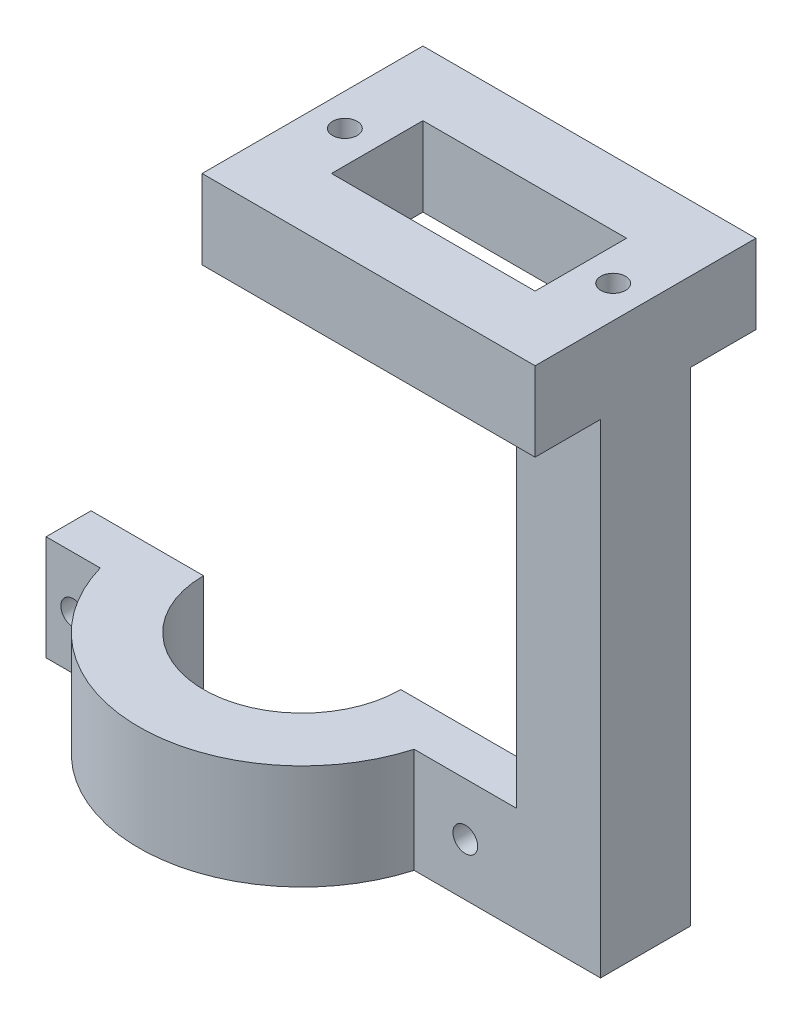
ISO-10303-21;
HEADER;
FILE_DESCRIPTION(('STEP AP214'),'2;1');
FILE_NAME('part.step','',(''),(''),'','','');
FILE_SCHEMA(('AUTOMOTIVE_DESIGN { 1 0 10303 214 1 1 1 1 }'));
ENDSEC;
DATA;
#1=APPLICATION_CONTEXT('core data for automotive mechanical design processes');
#2=APPLICATION_PROTOCOL_DEFINITION('international standard','automotive_design',2000,#1);
#3=PRODUCT_CONTEXT('',#1,'mechanical');
#4=PRODUCT('Part','Part','',(#3));
#5=PRODUCT_RELATED_PRODUCT_CATEGORY('part','',(#4));
#6=PRODUCT_DEFINITION_FORMATION('','',#4);
#7=PRODUCT_DEFINITION_CONTEXT('part definition',#1,'design');
#8=PRODUCT_DEFINITION('design','',#6,#7);
#9=PRODUCT_DEFINITION_SHAPE('','',#8);
#10=(LENGTH_UNIT() NAMED_UNIT(*) SI_UNIT(.MILLI.,.METRE.));
#11=(NAMED_UNIT(*) PLANE_ANGLE_UNIT() SI_UNIT($,.RADIAN.));
#12=(NAMED_UNIT(*) SI_UNIT($,.STERADIAN.) SOLID_ANGLE_UNIT());
#13=UNCERTAINTY_MEASURE_WITH_UNIT(LENGTH_MEASURE(1.E-05),#10,'distance_accuracy_value','');
#14=(GEOMETRIC_REPRESENTATION_CONTEXT(3) GLOBAL_UNCERTAINTY_ASSIGNED_CONTEXT((#13)) GLOBAL_UNIT_ASSIGNED_CONTEXT((#10,
#11,#12)) REPRESENTATION_CONTEXT('',''));
#15=CARTESIAN_POINT('',(0.,0.,0.));
#16=DIRECTION('',(0.,0.,1.));
#17=DIRECTION('',(1.,0.,0.));
#18=AXIS2_PLACEMENT_3D('',#15,#16,#17);
#19=CARTESIAN_POINT('',(-27.351479578733,-58.59,0.));
#20=DIRECTION('',(0.,-1.,0.));
#21=DIRECTION('',(0.,0.,-1.));
#22=AXIS2_PLACEMENT_3D('',#19,#20,#21);
#23=CYLINDRICAL_SURFACE('',#22,25.25);
#24=CARTESIAN_POINT('',(-27.351479578733,-58.59,0.));
#25=DIRECTION('',(0.,-1.,0.));
#26=DIRECTION('',(1.,0.,0.));
#27=AXIS2_PLACEMENT_3D('',#24,#25,#26);
#28=CIRCLE('',#27,25.25);
#29=CARTESIAN_POINT('',(-3.07823350409353,-58.59,6.95499999999999));
#30=VERTEX_POINT('',#29);
#31=CARTESIAN_POINT('',(-51.6247256533725,-58.59,6.955));
#32=VERTEX_POINT('',#31);
#33=EDGE_CURVE('E228',#30,#32,#28,.T.);
#34=ORIENTED_EDGE('',*,*,#33,.T.);
#35=DIRECTION('',(0.,-1.,0.));
#36=VECTOR('',#35,1.);
#37=CARTESIAN_POINT('',(-51.6247256533725,-58.59,6.955));
#38=LINE('',#37,#36);
#39=CARTESIAN_POINT('',(-51.6247256533725,-74.82,6.955));
#40=VERTEX_POINT('',#39);
#41=EDGE_CURVE('E12',#32,#40,#38,.T.);
#42=ORIENTED_EDGE('',*,*,#41,.T.);
#43=CARTESIAN_POINT('',(-27.351479578733,-74.82,0.));
#44=DIRECTION('',(0.,-1.,0.));
#45=DIRECTION('',(1.,0.,0.));
#46=AXIS2_PLACEMENT_3D('',#43,#44,#45);
#47=CIRCLE('',#46,25.25);
#48=CARTESIAN_POINT('',(-3.07823350409353,-74.82,6.955));
#49=VERTEX_POINT('',#48);
#50=EDGE_CURVE('E361',#49,#40,#47,.T.);
#51=ORIENTED_EDGE('',*,*,#50,.F.);
#52=DIRECTION('',(0.,-1.,0.));
#53=VECTOR('',#52,1.);
#54=CARTESIAN_POINT('',(-3.07823350409353,-58.59,6.955));
#55=LINE('',#54,#53);
#56=EDGE_CURVE('E224',#30,#49,#55,.T.);
#57=ORIENTED_EDGE('',*,*,#56,.F.);
#58=EDGE_LOOP('',(#34,#42,#51,#57));
#59=FACE_BOUND('',#58,.T.);
#60=ADVANCED_FACE('F63',(#59),#23,.T.);
#61=CARTESIAN_POINT('',(12.75,-74.82,6.955));
#62=DIRECTION('',(1.,0.,0.));
#63=DIRECTION('',(0.,0.,-1.));
#64=AXIS2_PLACEMENT_3D('',#61,#62,#63);
#65=PLANE('',#64);
#66=DIRECTION('',(0.,0.,-1.));
#67=VECTOR('',#66,1.);
#68=CARTESIAN_POINT('',(12.75,-58.59,-6.955));
#69=LINE('',#68,#67);
#70=CARTESIAN_POINT('',(12.75,-58.59,6.955));
#71=VERTEX_POINT('',#70);
#72=CARTESIAN_POINT('',(12.75,-58.59,0.));
#73=VERTEX_POINT('',#72);
#74=EDGE_CURVE('E206',#71,#73,#69,.T.);
#75=ORIENTED_EDGE('',*,*,#74,.F.);
#76=DIRECTION('',(0.,1.,0.));
#77=VECTOR('',#76,1.);
#78=CARTESIAN_POINT('',(12.75,-74.82,6.955));
#79=LINE('',#78,#77);
#80=CARTESIAN_POINT('',(12.75,0.,6.955));
#81=VERTEX_POINT('',#80);
#82=EDGE_CURVE('E254',#71,#81,#79,.T.);
#83=ORIENTED_EDGE('',*,*,#82,.T.);
#84=DIRECTION('',(0.,0.,-1.));
#85=VECTOR('',#84,1.);
#86=CARTESIAN_POINT('',(12.75,0.,6.955));
#87=LINE('',#86,#85);
#88=CARTESIAN_POINT('',(12.75,0.,-6.955));
#89=VERTEX_POINT('',#88);
#90=EDGE_CURVE('E245',#81,#89,#87,.T.);
#91=ORIENTED_EDGE('',*,*,#90,.T.);
#92=DIRECTION('',(0.,1.,0.));
#93=VECTOR('',#92,1.);
#94=CARTESIAN_POINT('',(12.75,-74.82,-6.955));
#95=LINE('',#94,#93);
#96=CARTESIAN_POINT('',(12.75,-74.82,-6.955));
#97=VERTEX_POINT('',#96);
#98=EDGE_CURVE('E252',#97,#89,#95,.T.);
#99=ORIENTED_EDGE('',*,*,#98,.F.);
#100=DIRECTION('',(0.,0.,1.));
#101=VECTOR('',#100,1.);
#102=CARTESIAN_POINT('',(12.75,-74.82,0.));
#103=LINE('',#102,#101);
#104=CARTESIAN_POINT('',(12.75,-74.82,0.));
#105=VERTEX_POINT('',#104);
#106=EDGE_CURVE('E209',#97,#105,#103,.T.);
#107=ORIENTED_EDGE('',*,*,#106,.T.);
#108=DIRECTION('',(0.,1.,0.));
#109=VECTOR('',#108,1.);
#110=CARTESIAN_POINT('',(12.75,-115.59,0.));
#111=LINE('',#110,#109);
#112=EDGE_CURVE('E202',#105,#73,#111,.T.);
#113=ORIENTED_EDGE('',*,*,#112,.T.);
#114=EDGE_LOOP('',(#75,#83,#91,#99,#107,#113));
#115=FACE_BOUND('',#114,.T.);
#116=ADVANCED_FACE('F204',(#115),#65,.F.);
#117=CARTESIAN_POINT('',(0.,0.,0.));
#118=DIRECTION('',(0.,1.,0.));
#119=DIRECTION('',(0.,0.,1.));
#120=AXIS2_PLACEMENT_3D('',#117,#118,#119);
#121=PLANE('',#120);
#122=CARTESIAN_POINT('',(-20.75,0.,0.));
#123=DIRECTION('',(0.,1.,0.));
#124=DIRECTION('',(0.,0.,1.));
#125=AXIS2_PLACEMENT_3D('',#122,#123,#124);
#126=CIRCLE('',#125,1.91);
#127=CARTESIAN_POINT('',(-20.75,0.,1.91));
#128=VERTEX_POINT('',#127);
#129=EDGE_CURVE('E266',#128,#128,#126,.T.);
#130=ORIENTED_EDGE('',*,*,#129,.T.);
#131=EDGE_LOOP('',(#130));
#132=FACE_BOUND('',#131,.T.);
#133=DIRECTION('',(1.,0.,0.));
#134=VECTOR('',#133,1.);
#135=CARTESIAN_POINT('',(12.75,0.,-6.955));
#136=LINE('',#135,#134);
#137=CARTESIAN_POINT('',(15.75,0.,-6.955));
#138=VERTEX_POINT('',#137);
#139=CARTESIAN_POINT('',(25.75,0.,-6.955));
#140=VERTEX_POINT('',#139);
#141=EDGE_CURVE('E72',#138,#140,#136,.T.);
#142=ORIENTED_EDGE('',*,*,#141,.F.);
#143=DIRECTION('',(0.,0.,-1.));
#144=VECTOR('',#143,1.);
#145=CARTESIAN_POINT('',(15.75,0.,-7.075));
#146=LINE('',#145,#144);
#147=CARTESIAN_POINT('',(15.75,0.,-7.075));
#148=VERTEX_POINT('',#147);
#149=EDGE_CURVE('E269',#138,#148,#146,.T.);
#150=ORIENTED_EDGE('',*,*,#149,.T.);
#151=DIRECTION('',(-1.,0.,0.));
#152=VECTOR('',#151,1.);
#153=CARTESIAN_POINT('',(-15.75,0.,-7.075));
#154=LINE('',#153,#152);
#155=CARTESIAN_POINT('',(-15.75,0.,-7.075));
#156=VERTEX_POINT('',#155);
#157=EDGE_CURVE('E285',#148,#156,#154,.T.);
#158=ORIENTED_EDGE('',*,*,#157,.T.);
#159=DIRECTION('',(0.,0.,1.));
#160=VECTOR('',#159,1.);
#161=CARTESIAN_POINT('',(-15.75,0.,-7.075));
#162=LINE('',#161,#160);
#163=CARTESIAN_POINT('',(-15.75,0.,7.075));
#164=VERTEX_POINT('',#163);
#165=EDGE_CURVE('E289',#156,#164,#162,.T.);
#166=ORIENTED_EDGE('',*,*,#165,.T.);
#167=DIRECTION('',(1.,0.,0.));
#168=VECTOR('',#167,1.);
#169=CARTESIAN_POINT('',(-15.75,0.,7.075));
#170=LINE('',#169,#168);
#171=CARTESIAN_POINT('',(15.75,0.,7.075));
#172=VERTEX_POINT('',#171);
#173=EDGE_CURVE('E275',#164,#172,#170,.T.);
#174=ORIENTED_EDGE('',*,*,#173,.T.);
#175=CARTESIAN_POINT('',(15.75,0.,6.955));
#176=VERTEX_POINT('',#175);
#177=EDGE_CURVE('E283',#172,#176,#146,.T.);
#178=ORIENTED_EDGE('',*,*,#177,.T.);
#179=DIRECTION('',(-1.,0.,0.));
#180=VECTOR('',#179,1.);
#181=CARTESIAN_POINT('',(12.75,0.,6.955));
#182=LINE('',#181,#180);
#183=CARTESIAN_POINT('',(25.75,0.,6.955));
#184=VERTEX_POINT('',#183);
#185=EDGE_CURVE('E242',#184,#176,#182,.T.);
#186=ORIENTED_EDGE('',*,*,#185,.F.);
#187=DIRECTION('',(0.,0.,-1.));
#188=VECTOR('',#187,1.);
#189=CARTESIAN_POINT('',(25.75,0.,-7.075));
#190=LINE('',#189,#188);
#191=CARTESIAN_POINT('',(25.75,0.,17.075));
#192=VERTEX_POINT('',#191);
#193=EDGE_CURVE('E315',#192,#184,#190,.T.);
#194=ORIENTED_EDGE('',*,*,#193,.F.);
#195=DIRECTION('',(1.,0.,0.));
#196=VECTOR('',#195,1.);
#197=CARTESIAN_POINT('',(-15.75,0.,17.075));
#198=LINE('',#197,#196);
#199=CARTESIAN_POINT('',(-25.75,0.,17.075));
#200=VERTEX_POINT('',#199);
#201=EDGE_CURVE('E308',#200,#192,#198,.T.);
#202=ORIENTED_EDGE('',*,*,#201,.F.);
#203=DIRECTION('',(0.,0.,1.));
#204=VECTOR('',#203,1.);
#205=CARTESIAN_POINT('',(-25.75,0.,-7.075));
#206=LINE('',#205,#204);
#207=CARTESIAN_POINT('',(-25.75,0.,-17.075));
#208=VERTEX_POINT('',#207);
#209=EDGE_CURVE('E320',#208,#200,#206,.T.);
#210=ORIENTED_EDGE('',*,*,#209,.F.);
#211=DIRECTION('',(-1.,0.,0.));
#212=VECTOR('',#211,1.);
#213=CARTESIAN_POINT('',(-15.75,0.,-17.075));
#214=LINE('',#213,#212);
#215=CARTESIAN_POINT('',(25.75,0.,-17.075));
#216=VERTEX_POINT('',#215);
#217=EDGE_CURVE('E318',#216,#208,#214,.T.);
#218=ORIENTED_EDGE('',*,*,#217,.F.);
#219=EDGE_CURVE('E303',#140,#216,#190,.T.);
#220=ORIENTED_EDGE('',*,*,#219,.F.);
#221=EDGE_LOOP('',(#142,#150,#158,#166,#174,#178,#186,#194,#202,#210,#218,#220));
#222=FACE_BOUND('',#221,.T.);
#223=ADVANCED_FACE('F411',(#132,#222),#121,.F.);
#224=CARTESIAN_POINT('',(0.,12.25,0.));
#225=DIRECTION('',(0.,1.,0.));
#226=DIRECTION('',(0.,0.,1.));
#227=AXIS2_PLACEMENT_3D('',#224,#225,#226);
#228=PLANE('',#227);
#229=CARTESIAN_POINT('',(20.75,12.25,0.));
#230=DIRECTION('',(0.,1.,0.));
#231=DIRECTION('',(0.,0.,1.));
#232=AXIS2_PLACEMENT_3D('',#229,#230,#231);
#233=CIRCLE('',#232,1.91);
#234=CARTESIAN_POINT('',(20.75,12.25,1.91));
#235=VERTEX_POINT('',#234);
#236=EDGE_CURVE('E259',#235,#235,#233,.T.);
#237=ORIENTED_EDGE('',*,*,#236,.F.);
#238=EDGE_LOOP('',(#237));
#239=FACE_BOUND('',#238,.T.);
#240=CARTESIAN_POINT('',(-20.75,12.25,0.));
#241=DIRECTION('',(0.,1.,0.));
#242=DIRECTION('',(0.,0.,1.));
#243=AXIS2_PLACEMENT_3D('',#240,#241,#242);
#244=CIRCLE('',#243,1.91);
#245=CARTESIAN_POINT('',(-20.75,12.25,1.91));
#246=VERTEX_POINT('',#245);
#247=EDGE_CURVE('E263',#246,#246,#244,.T.);
#248=ORIENTED_EDGE('',*,*,#247,.F.);
#249=EDGE_LOOP('',(#248));
#250=FACE_BOUND('',#249,.T.);
#251=DIRECTION('',(0.,0.,-1.));
#252=VECTOR('',#251,1.);
#253=CARTESIAN_POINT('',(25.75,12.25,-7.075));
#254=LINE('',#253,#252);
#255=CARTESIAN_POINT('',(25.75,12.25,17.075));
#256=VERTEX_POINT('',#255);
#257=CARTESIAN_POINT('',(25.75,12.25,-17.075));
#258=VERTEX_POINT('',#257);
#259=EDGE_CURVE('E304',#256,#258,#254,.T.);
#260=ORIENTED_EDGE('',*,*,#259,.T.);
#261=DIRECTION('',(-1.,0.,0.));
#262=VECTOR('',#261,1.);
#263=CARTESIAN_POINT('',(-15.75,12.25,-17.075));
#264=LINE('',#263,#262);
#265=CARTESIAN_POINT('',(-25.75,12.25,-17.075));
#266=VERTEX_POINT('',#265);
#267=EDGE_CURVE('E307',#258,#266,#264,.T.);
#268=ORIENTED_EDGE('',*,*,#267,.T.);
#269=DIRECTION('',(0.,0.,1.));
#270=VECTOR('',#269,1.);
#271=CARTESIAN_POINT('',(-25.75,12.25,-7.075));
#272=LINE('',#271,#270);
#273=CARTESIAN_POINT('',(-25.75,12.25,17.075));
#274=VERTEX_POINT('',#273);
#275=EDGE_CURVE('E310',#266,#274,#272,.T.);
#276=ORIENTED_EDGE('',*,*,#275,.T.);
#277=DIRECTION('',(1.,0.,0.));
#278=VECTOR('',#277,1.);
#279=CARTESIAN_POINT('',(-15.75,12.25,17.075));
#280=LINE('',#279,#278);
#281=EDGE_CURVE('E312',#274,#256,#280,.T.);
#282=ORIENTED_EDGE('',*,*,#281,.T.);
#283=EDGE_LOOP('',(#260,#268,#276,#282));
#284=FACE_BOUND('',#283,.T.);
#285=DIRECTION('',(-1.,0.,0.));
#286=VECTOR('',#285,1.);
#287=CARTESIAN_POINT('',(-15.75,12.25,-7.075));
#288=LINE('',#287,#286);
#289=CARTESIAN_POINT('',(15.75,12.25,-7.075));
#290=VERTEX_POINT('',#289);
#291=CARTESIAN_POINT('',(-15.75,12.25,-7.075));
#292=VERTEX_POINT('',#291);
#293=EDGE_CURVE('E274',#290,#292,#288,.T.);
#294=ORIENTED_EDGE('',*,*,#293,.F.);
#295=DIRECTION('',(0.,0.,-1.));
#296=VECTOR('',#295,1.);
#297=CARTESIAN_POINT('',(15.75,12.25,-7.075));
#298=LINE('',#297,#296);
#299=CARTESIAN_POINT('',(15.75,12.25,7.075));
#300=VERTEX_POINT('',#299);
#301=EDGE_CURVE('E272',#300,#290,#298,.T.);
#302=ORIENTED_EDGE('',*,*,#301,.F.);
#303=DIRECTION('',(1.,0.,0.));
#304=VECTOR('',#303,1.);
#305=CARTESIAN_POINT('',(-15.75,12.25,7.075));
#306=LINE('',#305,#304);
#307=CARTESIAN_POINT('',(-15.75,12.25,7.075));
#308=VERTEX_POINT('',#307);
#309=EDGE_CURVE('E280',#308,#300,#306,.T.);
#310=ORIENTED_EDGE('',*,*,#309,.F.);
#311=DIRECTION('',(0.,0.,1.));
#312=VECTOR('',#311,1.);
#313=CARTESIAN_POINT('',(-15.75,12.25,-7.075));
#314=LINE('',#313,#312);
#315=EDGE_CURVE('E277',#292,#308,#314,.T.);
#316=ORIENTED_EDGE('',*,*,#315,.F.);
#317=EDGE_LOOP('',(#294,#302,#310,#316));
#318=FACE_BOUND('',#317,.T.);
#319=ADVANCED_FACE('F458',(#239,#250,#284,#318),#228,.T.);
#320=CARTESIAN_POINT('',(25.75,12.25,-7.075));
#321=DIRECTION('',(-1.,0.,0.));
#322=DIRECTION('',(0.,0.,1.));
#323=AXIS2_PLACEMENT_3D('',#320,#321,#322);
#324=PLANE('',#323);
#325=ORIENTED_EDGE('',*,*,#193,.T.);
#326=DIRECTION('',(0.,1.,0.));
#327=VECTOR('',#326,1.);
#328=CARTESIAN_POINT('',(25.75,-74.82,6.955));
#329=LINE('',#328,#327);
#330=CARTESIAN_POINT('',(25.75,-74.82,6.955));
#331=VERTEX_POINT('',#330);
#332=EDGE_CURVE('E256',#331,#184,#329,.T.);
#333=ORIENTED_EDGE('',*,*,#332,.F.);
#334=DIRECTION('',(0.,0.,1.));
#335=VECTOR('',#334,1.);
#336=CARTESIAN_POINT('',(25.75,-74.82,6.955));
#337=LINE('',#336,#335);
#338=CARTESIAN_POINT('',(25.75,-74.82,-6.955));
#339=VERTEX_POINT('',#338);
#340=EDGE_CURVE('E232',#339,#331,#337,.T.);
#341=ORIENTED_EDGE('',*,*,#340,.F.);
#342=DIRECTION('',(0.,1.,0.));
#343=VECTOR('',#342,1.);
#344=CARTESIAN_POINT('',(25.75,-74.82,-6.955));
#345=LINE('',#344,#343);
#346=EDGE_CURVE('E241',#339,#140,#345,.T.);
#347=ORIENTED_EDGE('',*,*,#346,.T.);
#348=ORIENTED_EDGE('',*,*,#219,.T.);
#349=DIRECTION('',(0.,-1.,0.));
#350=VECTOR('',#349,1.);
#351=CARTESIAN_POINT('',(25.75,12.25,-17.075));
#352=LINE('',#351,#350);
#353=EDGE_CURVE('E331',#258,#216,#352,.T.);
#354=ORIENTED_EDGE('',*,*,#353,.F.);
#355=ORIENTED_EDGE('',*,*,#259,.F.);
#356=DIRECTION('',(0.,-1.,0.));
#357=VECTOR('',#356,1.);
#358=CARTESIAN_POINT('',(25.75,12.25,17.075));
#359=LINE('',#358,#357);
#360=EDGE_CURVE('E314',#256,#192,#359,.T.);
#361=ORIENTED_EDGE('',*,*,#360,.T.);
#362=EDGE_LOOP('',(#325,#333,#341,#347,#348,#354,#355,#361));
#363=FACE_BOUND('',#362,.T.);
#364=ADVANCED_FACE('F65',(#363),#324,.F.);
#365=CARTESIAN_POINT('',(-15.75,12.25,-17.075));
#366=DIRECTION('',(0.,0.,1.));
#367=DIRECTION('',(1.,0.,0.));
#368=AXIS2_PLACEMENT_3D('',#365,#366,#367);
#369=PLANE('',#368);
#370=ORIENTED_EDGE('',*,*,#217,.T.);
#371=DIRECTION('',(0.,-1.,0.));
#372=VECTOR('',#371,1.);
#373=CARTESIAN_POINT('',(-25.75,12.25,-17.075));
#374=LINE('',#373,#372);
#375=EDGE_CURVE('E328',#266,#208,#374,.T.);
#376=ORIENTED_EDGE('',*,*,#375,.F.);
#377=ORIENTED_EDGE('',*,*,#267,.F.);
#378=ORIENTED_EDGE('',*,*,#353,.T.);
#379=EDGE_LOOP('',(#370,#376,#377,#378));
#380=FACE_BOUND('',#379,.T.);
#381=ADVANCED_FACE('F470',(#380),#369,.F.);
#382=CARTESIAN_POINT('',(-25.75,12.25,-7.075));
#383=DIRECTION('',(1.,0.,0.));
#384=DIRECTION('',(0.,0.,-1.));
#385=AXIS2_PLACEMENT_3D('',#382,#383,#384);
#386=PLANE('',#385);
#387=ORIENTED_EDGE('',*,*,#209,.T.);
#388=DIRECTION('',(0.,-1.,0.));
#389=VECTOR('',#388,1.);
#390=CARTESIAN_POINT('',(-25.75,12.25,17.075));
#391=LINE('',#390,#389);
#392=EDGE_CURVE('E325',#274,#200,#391,.T.);
#393=ORIENTED_EDGE('',*,*,#392,.F.);
#394=ORIENTED_EDGE('',*,*,#275,.F.);
#395=ORIENTED_EDGE('',*,*,#375,.T.);
#396=EDGE_LOOP('',(#387,#393,#394,#395));
#397=FACE_BOUND('',#396,.T.);
#398=ADVANCED_FACE('F467',(#397),#386,.F.);
#399=CARTESIAN_POINT('',(-15.75,12.25,17.075));
#400=DIRECTION('',(0.,0.,-1.));
#401=DIRECTION('',(-1.,0.,0.));
#402=AXIS2_PLACEMENT_3D('',#399,#400,#401);
#403=PLANE('',#402);
#404=ORIENTED_EDGE('',*,*,#201,.T.);
#405=ORIENTED_EDGE('',*,*,#360,.F.);
#406=ORIENTED_EDGE('',*,*,#281,.F.);
#407=ORIENTED_EDGE('',*,*,#392,.T.);
#408=EDGE_LOOP('',(#404,#405,#406,#407));
#409=FACE_BOUND('',#408,.T.);
#410=ADVANCED_FACE('F456',(#409),#403,.F.);
#411=CARTESIAN_POINT('',(15.75,12.25,-7.075));
#412=DIRECTION('',(-1.,0.,0.));
#413=DIRECTION('',(0.,0.,1.));
#414=AXIS2_PLACEMENT_3D('',#411,#412,#413);
#415=PLANE('',#414);
#416=ORIENTED_EDGE('',*,*,#177,.F.);
#417=DIRECTION('',(0.,-1.,0.));
#418=VECTOR('',#417,1.);
#419=CARTESIAN_POINT('',(15.75,12.25,7.075));
#420=LINE('',#419,#418);
#421=EDGE_CURVE('E282',#300,#172,#420,.T.);
#422=ORIENTED_EDGE('',*,*,#421,.F.);
#423=ORIENTED_EDGE('',*,*,#301,.T.);
#424=DIRECTION('',(0.,-1.,0.));
#425=VECTOR('',#424,1.);
#426=CARTESIAN_POINT('',(15.75,12.25,-7.075));
#427=LINE('',#426,#425);
#428=EDGE_CURVE('E300',#290,#148,#427,.T.);
#429=ORIENTED_EDGE('',*,*,#428,.T.);
#430=ORIENTED_EDGE('',*,*,#149,.F.);
#431=EDGE_CURVE('E286',#176,#138,#146,.T.);
#432=ORIENTED_EDGE('',*,*,#431,.F.);
#433=EDGE_LOOP('',(#416,#422,#423,#429,#430,#432));
#434=FACE_BOUND('',#433,.T.);
#435=ADVANCED_FACE('F452',(#434),#415,.T.);
#436=CARTESIAN_POINT('',(-15.75,12.25,-7.075));
#437=DIRECTION('',(0.,0.,1.));
#438=DIRECTION('',(1.,0.,0.));
#439=AXIS2_PLACEMENT_3D('',#436,#437,#438);
#440=PLANE('',#439);
#441=ORIENTED_EDGE('',*,*,#157,.F.);
#442=ORIENTED_EDGE('',*,*,#428,.F.);
#443=ORIENTED_EDGE('',*,*,#293,.T.);
#444=DIRECTION('',(0.,-1.,0.));
#445=VECTOR('',#444,1.);
#446=CARTESIAN_POINT('',(-15.75,12.25,-7.075));
#447=LINE('',#446,#445);
#448=EDGE_CURVE('E298',#292,#156,#447,.T.);
#449=ORIENTED_EDGE('',*,*,#448,.T.);
#450=EDGE_LOOP('',(#441,#442,#443,#449));
#451=FACE_BOUND('',#450,.T.);
#452=ADVANCED_FACE('F448',(#451),#440,.T.);
#453=CARTESIAN_POINT('',(-15.75,12.25,-7.075));
#454=DIRECTION('',(1.,0.,0.));
#455=DIRECTION('',(0.,0.,-1.));
#456=AXIS2_PLACEMENT_3D('',#453,#454,#455);
#457=PLANE('',#456);
#458=ORIENTED_EDGE('',*,*,#165,.F.);
#459=ORIENTED_EDGE('',*,*,#448,.F.);
#460=ORIENTED_EDGE('',*,*,#315,.T.);
#461=DIRECTION('',(0.,-1.,0.));
#462=VECTOR('',#461,1.);
#463=CARTESIAN_POINT('',(-15.75,12.25,7.075));
#464=LINE('',#463,#462);
#465=EDGE_CURVE('E296',#308,#164,#464,.T.);
#466=ORIENTED_EDGE('',*,*,#465,.T.);
#467=EDGE_LOOP('',(#458,#459,#460,#466));
#468=FACE_BOUND('',#467,.T.);
#469=ADVANCED_FACE('F444',(#468),#457,.T.);
#470=CARTESIAN_POINT('',(-15.75,12.25,7.075));
#471=DIRECTION('',(0.,0.,-1.));
#472=DIRECTION('',(-1.,0.,0.));
#473=AXIS2_PLACEMENT_3D('',#470,#471,#472);
#474=PLANE('',#473);
#475=ORIENTED_EDGE('',*,*,#173,.F.);
#476=ORIENTED_EDGE('',*,*,#465,.F.);
#477=ORIENTED_EDGE('',*,*,#309,.T.);
#478=ORIENTED_EDGE('',*,*,#421,.T.);
#479=EDGE_LOOP('',(#475,#476,#477,#478));
#480=FACE_BOUND('',#479,.T.);
#481=ADVANCED_FACE('F440',(#480),#474,.T.);
#482=CARTESIAN_POINT('',(-20.75,0.,0.));
#483=DIRECTION('',(0.,1.,0.));
#484=DIRECTION('',(0.,0.,1.));
#485=AXIS2_PLACEMENT_3D('',#482,#483,#484);
#486=CYLINDRICAL_SURFACE('',#485,1.91);
#487=ORIENTED_EDGE('',*,*,#129,.F.);
#488=EDGE_LOOP('',(#487));
#489=FACE_BOUND('',#488,.T.);
#490=ORIENTED_EDGE('',*,*,#247,.T.);
#491=EDGE_LOOP('',(#490));
#492=FACE_BOUND('',#491,.T.);
#493=ADVANCED_FACE('F436',(#489,#492),#486,.F.);
#494=CARTESIAN_POINT('',(20.75,0.,0.));
#495=DIRECTION('',(0.,1.,0.));
#496=DIRECTION('',(0.,0.,1.));
#497=AXIS2_PLACEMENT_3D('',#494,#495,#496);
#498=CYLINDRICAL_SURFACE('',#497,1.91);
#499=CARTESIAN_POINT('',(20.75,0.,0.));
#500=DIRECTION('',(0.,1.,0.));
#501=DIRECTION('',(0.,0.,1.));
#502=AXIS2_PLACEMENT_3D('',#499,#500,#501);
#503=CIRCLE('',#502,1.91);
#504=CARTESIAN_POINT('',(20.75,0.,1.91));
#505=VERTEX_POINT('',#504);
#506=EDGE_CURVE('E260',#505,#505,#503,.T.);
#507=ORIENTED_EDGE('',*,*,#506,.F.);
#508=EDGE_LOOP('',(#507));
#509=FACE_BOUND('',#508,.T.);
#510=ORIENTED_EDGE('',*,*,#236,.T.);
#511=EDGE_LOOP('',(#510));
#512=FACE_BOUND('',#511,.T.);
#513=ADVANCED_FACE('F422',(#509,#512),#498,.F.);
#514=CARTESIAN_POINT('',(0.,-74.82,0.));
#515=DIRECTION('',(0.,-1.,0.));
#516=DIRECTION('',(0.,0.,-1.));
#517=AXIS2_PLACEMENT_3D('',#514,#515,#516);
#518=PLANE('',#517);
#519=ORIENTED_EDGE('',*,*,#106,.F.);
#520=DIRECTION('',(1.,0.,0.));
#521=VECTOR('',#520,1.);
#522=CARTESIAN_POINT('',(12.75,-74.82,-6.955));
#523=LINE('',#522,#521);
#524=EDGE_CURVE('E239',#97,#339,#523,.T.);
#525=ORIENTED_EDGE('',*,*,#524,.T.);
#526=ORIENTED_EDGE('',*,*,#340,.T.);
#527=DIRECTION('',(-1.,0.,0.));
#528=VECTOR('',#527,1.);
#529=CARTESIAN_POINT('',(12.75,-74.82,6.955));
#530=LINE('',#529,#528);
#531=EDGE_CURVE('E235',#331,#49,#530,.T.);
#532=ORIENTED_EDGE('',*,*,#531,.T.);
#533=ORIENTED_EDGE('',*,*,#50,.T.);
#534=DIRECTION('',(-1.,0.,0.));
#535=VECTOR('',#534,1.);
#536=CARTESIAN_POINT('',(-50.,-74.82,6.955));
#537=LINE('',#536,#535);
#538=CARTESIAN_POINT('',(-60.,-74.82,6.955));
#539=VERTEX_POINT('',#538);
#540=EDGE_CURVE('E355',#40,#539,#537,.T.);
#541=ORIENTED_EDGE('',*,*,#540,.T.);
#542=DIRECTION('',(0.,0.,-1.));
#543=VECTOR('',#542,1.);
#544=CARTESIAN_POINT('',(-60.,-74.82,-6.955));
#545=LINE('',#544,#543);
#546=CARTESIAN_POINT('',(-60.,-74.82,0.));
#547=VERTEX_POINT('',#546);
#548=EDGE_CURVE('E352',#539,#547,#545,.T.);
#549=ORIENTED_EDGE('',*,*,#548,.T.);
#550=DIRECTION('',(-1.,0.,0.));
#551=VECTOR('',#550,1.);
#552=CARTESIAN_POINT('',(0.,-74.82,0.));
#553=LINE('',#552,#551);
#554=CARTESIAN_POINT('',(-42.601479578733,-74.82,0.));
#555=VERTEX_POINT('',#554);
#556=EDGE_CURVE('E88',#555,#547,#553,.T.);
#557=ORIENTED_EDGE('',*,*,#556,.F.);
#558=CARTESIAN_POINT('',(-27.351479578733,-74.82,0.));
#559=DIRECTION('',(0.,-1.,0.));
#560=DIRECTION('',(0.,0.,-1.));
#561=AXIS2_PLACEMENT_3D('',#558,#559,#560);
#562=CIRCLE('',#561,15.25);
#563=CARTESIAN_POINT('',(-12.101479578733,-74.82,0.));
#564=VERTEX_POINT('',#563);
#565=EDGE_CURVE('E336',#564,#555,#562,.T.);
#566=ORIENTED_EDGE('',*,*,#565,.F.);
#567=EDGE_CURVE('E80',#105,#564,#553,.T.);
#568=ORIENTED_EDGE('',*,*,#567,.F.);
#569=EDGE_LOOP('',(#519,#525,#526,#532,#533,#541,#549,#557,#566,#568));
#570=FACE_BOUND('',#569,.T.);
#571=ADVANCED_FACE('F368',(#570),#518,.T.);
#572=CARTESIAN_POINT('',(12.75,-74.82,-6.955));
#573=DIRECTION('',(0.,0.,1.));
#574=DIRECTION('',(1.,0.,0.));
#575=AXIS2_PLACEMENT_3D('',#572,#573,#574);
#576=PLANE('',#575);
#577=ORIENTED_EDGE('',*,*,#524,.F.);
#578=ORIENTED_EDGE('',*,*,#98,.T.);
#579=EDGE_CURVE('E236',#89,#138,#136,.T.);
#580=ORIENTED_EDGE('',*,*,#579,.T.);
#581=ORIENTED_EDGE('',*,*,#141,.T.);
#582=ORIENTED_EDGE('',*,*,#346,.F.);
#583=EDGE_LOOP('',(#577,#578,#580,#581,#582));
#584=FACE_BOUND('',#583,.T.);
#585=ADVANCED_FACE('F421',(#584),#576,.F.);
#586=CARTESIAN_POINT('',(12.75,-74.82,6.955));
#587=DIRECTION('',(0.,0.,-1.));
#588=DIRECTION('',(-1.,0.,0.));
#589=AXIS2_PLACEMENT_3D('',#586,#587,#588);
#590=PLANE('',#589);
#591=CARTESIAN_POINT('',(4.83588324795129,-66.7050000000066,6.955));
#592=DIRECTION('',(0.,0.,-1.));
#593=DIRECTION('',(-1.,0.,0.));
#594=AXIS2_PLACEMENT_3D('',#591,#592,#593);
#595=CIRCLE('',#594,1.91);
#596=CARTESIAN_POINT('',(2.92588324795129,-66.7050000000066,6.955));
#597=VERTEX_POINT('',#596);
#598=EDGE_CURVE('E334',#597,#597,#595,.T.);
#599=ORIENTED_EDGE('',*,*,#598,.T.);
#600=EDGE_LOOP('',(#599));
#601=FACE_BOUND('',#600,.T.);
#602=DIRECTION('',(1.,0.,0.));
#603=VECTOR('',#602,1.);
#604=CARTESIAN_POINT('',(-3.25,-58.59,6.95499999999999));
#605=LINE('',#604,#603);
#606=EDGE_CURVE('E223',#30,#71,#605,.T.);
#607=ORIENTED_EDGE('',*,*,#606,.F.);
#608=ORIENTED_EDGE('',*,*,#56,.T.);
#609=ORIENTED_EDGE('',*,*,#531,.F.);
#610=ORIENTED_EDGE('',*,*,#332,.T.);
#611=ORIENTED_EDGE('',*,*,#185,.T.);
#612=EDGE_CURVE('E226',#176,#81,#182,.T.);
#613=ORIENTED_EDGE('',*,*,#612,.T.);
#614=ORIENTED_EDGE('',*,*,#82,.F.);
#615=EDGE_LOOP('',(#607,#608,#609,#610,#611,#613,#614));
#616=FACE_BOUND('',#615,.T.);
#617=ADVANCED_FACE('F428',(#601,#616),#590,.F.);
#618=CARTESIAN_POINT('',(0.,0.,0.));
#619=DIRECTION('',(0.,-1.,0.));
#620=DIRECTION('',(0.,0.,-1.));
#621=AXIS2_PLACEMENT_3D('',#618,#619,#620);
#622=PLANE('',#621);
#623=ORIENTED_EDGE('',*,*,#612,.F.);
#624=ORIENTED_EDGE('',*,*,#431,.T.);
#625=ORIENTED_EDGE('',*,*,#579,.F.);
#626=ORIENTED_EDGE('',*,*,#90,.F.);
#627=EDGE_LOOP('',(#623,#624,#625,#626));
#628=FACE_BOUND('',#627,.T.);
#629=ADVANCED_FACE('F425',(#628),#622,.F.);
#630=ORIENTED_EDGE('',*,*,#506,.T.);
#631=EDGE_LOOP('',(#630));
#632=FACE_BOUND('',#631,.T.);
#633=ADVANCED_FACE('F418',(#632),#622,.F.);
#634=CARTESIAN_POINT('',(-3.25,-58.59,-6.95500000000001));
#635=DIRECTION('',(0.,-1.,0.));
#636=DIRECTION('',(0.,0.,-1.));
#637=AXIS2_PLACEMENT_3D('',#634,#635,#636);
#638=PLANE('',#637);
#639=ORIENTED_EDGE('',*,*,#74,.T.);
#640=DIRECTION('',(1.,0.,0.));
#641=VECTOR('',#640,1.);
#642=CARTESIAN_POINT('',(12.75,-58.59,0.));
#643=LINE('',#642,#641);
#644=CARTESIAN_POINT('',(-12.101479578733,-58.59,0.));
#645=VERTEX_POINT('',#644);
#646=EDGE_CURVE('E213',#645,#73,#643,.T.);
#647=ORIENTED_EDGE('',*,*,#646,.F.);
#648=CARTESIAN_POINT('',(-27.351479578733,-58.59,0.));
#649=DIRECTION('',(0.,-1.,0.));
#650=DIRECTION('',(0.,0.,-1.));
#651=AXIS2_PLACEMENT_3D('',#648,#649,#650);
#652=CIRCLE('',#651,15.25);
#653=CARTESIAN_POINT('',(-42.601479578733,-58.59,0.));
#654=VERTEX_POINT('',#653);
#655=EDGE_CURVE('E359',#645,#654,#652,.T.);
#656=ORIENTED_EDGE('',*,*,#655,.T.);
#657=CARTESIAN_POINT('',(-60.,-58.59,0.));
#658=VERTEX_POINT('',#657);
#659=EDGE_CURVE('E210',#658,#654,#643,.T.);
#660=ORIENTED_EDGE('',*,*,#659,.F.);
#661=DIRECTION('',(0.,0.,1.));
#662=VECTOR('',#661,1.);
#663=CARTESIAN_POINT('',(-60.,-58.59,-6.955));
#664=LINE('',#663,#662);
#665=CARTESIAN_POINT('',(-60.,-58.59,6.955));
#666=VERTEX_POINT('',#665);
#667=EDGE_CURVE('E340',#658,#666,#664,.T.);
#668=ORIENTED_EDGE('',*,*,#667,.T.);
#669=DIRECTION('',(-1.,0.,0.));
#670=VECTOR('',#669,1.);
#671=CARTESIAN_POINT('',(-50.,-58.59,6.955));
#672=LINE('',#671,#670);
#673=EDGE_CURVE('E337',#32,#666,#672,.T.);
#674=ORIENTED_EDGE('',*,*,#673,.F.);
#675=ORIENTED_EDGE('',*,*,#33,.F.);
#676=ORIENTED_EDGE('',*,*,#606,.T.);
#677=EDGE_LOOP('',(#639,#647,#656,#660,#668,#674,#675,#676));
#678=FACE_BOUND('',#677,.T.);
#679=ADVANCED_FACE('F221',(#678),#638,.F.);
#680=CARTESIAN_POINT('',(-27.351479578733,-58.59,0.));
#681=DIRECTION('',(0.,-1.,0.));
#682=DIRECTION('',(0.,0.,-1.));
#683=AXIS2_PLACEMENT_3D('',#680,#681,#682);
#684=CYLINDRICAL_SURFACE('',#683,15.25);
#685=ORIENTED_EDGE('',*,*,#565,.T.);
#686=DIRECTION('',(0.,-1.,0.));
#687=VECTOR('',#686,1.);
#688=CARTESIAN_POINT('',(-42.601479578733,-58.59,0.));
#689=LINE('',#688,#687);
#690=EDGE_CURVE('E382',#555,#654,#689,.F.);
#691=ORIENTED_EDGE('',*,*,#690,.T.);
#692=ORIENTED_EDGE('',*,*,#655,.F.);
#693=DIRECTION('',(0.,-1.,0.));
#694=VECTOR('',#693,1.);
#695=CARTESIAN_POINT('',(-12.101479578733,-58.59,0.));
#696=LINE('',#695,#694);
#697=EDGE_CURVE('E216',#645,#564,#696,.T.);
#698=ORIENTED_EDGE('',*,*,#697,.T.);
#699=EDGE_LOOP('',(#685,#691,#692,#698));
#700=FACE_BOUND('',#699,.T.);
#701=ADVANCED_FACE('F385',(#700),#684,.F.);
#702=CARTESIAN_POINT('',(4.83588324795129,-66.7050000000066,25.25));
#703=DIRECTION('',(0.,0.,-1.));
#704=DIRECTION('',(-1.,0.,0.));
#705=AXIS2_PLACEMENT_3D('',#702,#703,#704);
#706=CYLINDRICAL_SURFACE('',#705,1.91);
#707=CARTESIAN_POINT('',(4.83588324795129,-66.7050000000066,0.));
#708=DIRECTION('',(0.,0.,1.));
#709=DIRECTION('',(1.,0.,0.));
#710=AXIS2_PLACEMENT_3D('',#707,#708,#709);
#711=CIRCLE('',#710,1.91);
#712=CARTESIAN_POINT('',(6.74588324795129,-66.7050000000066,0.));
#713=VERTEX_POINT('',#712);
#714=EDGE_CURVE('E386',#713,#713,#711,.F.);
#715=ORIENTED_EDGE('',*,*,#714,.T.);
#716=EDGE_LOOP('',(#715));
#717=FACE_BOUND('',#716,.T.);
#718=ORIENTED_EDGE('',*,*,#598,.F.);
#719=EDGE_LOOP('',(#718));
#720=FACE_BOUND('',#719,.T.);
#721=ADVANCED_FACE('F537',(#717,#720),#706,.F.);
#722=CARTESIAN_POINT('',(-50.,-58.59,6.955));
#723=DIRECTION('',(0.,0.,-1.));
#724=DIRECTION('',(-1.,0.,0.));
#725=AXIS2_PLACEMENT_3D('',#722,#723,#724);
#726=PLANE('',#725);
#727=CARTESIAN_POINT('',(-55.8123628266859,-66.7050000000066,6.955));
#728=DIRECTION('',(0.,0.,-1.));
#729=DIRECTION('',(-1.,0.,0.));
#730=AXIS2_PLACEMENT_3D('',#727,#728,#729);
#731=CIRCLE('',#730,1.91);
#732=CARTESIAN_POINT('',(-57.7223628266859,-66.7050000000066,6.955));
#733=VERTEX_POINT('',#732);
#734=EDGE_CURVE('E338',#733,#733,#731,.T.);
#735=ORIENTED_EDGE('',*,*,#734,.T.);
#736=EDGE_LOOP('',(#735));
#737=FACE_BOUND('',#736,.T.);
#738=ORIENTED_EDGE('',*,*,#41,.F.);
#739=ORIENTED_EDGE('',*,*,#673,.T.);
#740=DIRECTION('',(0.,-1.,0.));
#741=VECTOR('',#740,1.);
#742=CARTESIAN_POINT('',(-60.,-58.59,6.955));
#743=LINE('',#742,#741);
#744=EDGE_CURVE('E343',#666,#539,#743,.T.);
#745=ORIENTED_EDGE('',*,*,#744,.T.);
#746=ORIENTED_EDGE('',*,*,#540,.F.);
#747=EDGE_LOOP('',(#738,#739,#745,#746));
#748=FACE_BOUND('',#747,.T.);
#749=ADVANCED_FACE('F373',(#737,#748),#726,.F.);
#750=CARTESIAN_POINT('',(-60.,0.,0.));
#751=DIRECTION('',(-1.,0.,0.));
#752=DIRECTION('',(0.,0.,1.));
#753=AXIS2_PLACEMENT_3D('',#750,#751,#752);
#754=PLANE('',#753);
#755=DIRECTION('',(0.,1.,0.));
#756=VECTOR('',#755,1.);
#757=CARTESIAN_POINT('',(-60.,0.,0.));
#758=LINE('',#757,#756);
#759=EDGE_CURVE('E380',#547,#658,#758,.T.);
#760=ORIENTED_EDGE('',*,*,#759,.F.);
#761=ORIENTED_EDGE('',*,*,#548,.F.);
#762=ORIENTED_EDGE('',*,*,#744,.F.);
#763=ORIENTED_EDGE('',*,*,#667,.F.);
#764=EDGE_LOOP('',(#760,#761,#762,#763));
#765=FACE_BOUND('',#764,.T.);
#766=ADVANCED_FACE('F378',(#765),#754,.T.);
#767=CARTESIAN_POINT('',(-55.8123628266859,-66.7050000000066,25.25));
#768=DIRECTION('',(0.,0.,-1.));
#769=DIRECTION('',(-1.,0.,0.));
#770=AXIS2_PLACEMENT_3D('',#767,#768,#769);
#771=CYLINDRICAL_SURFACE('',#770,1.91);
#772=CARTESIAN_POINT('',(-55.8123628266859,-66.7050000000066,0.));
#773=DIRECTION('',(0.,0.,1.));
#774=DIRECTION('',(1.,0.,0.));
#775=AXIS2_PLACEMENT_3D('',#772,#773,#774);
#776=CIRCLE('',#775,1.91);
#777=CARTESIAN_POINT('',(-53.9023628266859,-66.7050000000066,0.));
#778=VERTEX_POINT('',#777);
#779=EDGE_CURVE('E67',#778,#778,#776,.F.);
#780=ORIENTED_EDGE('',*,*,#779,.T.);
#781=EDGE_LOOP('',(#780));
#782=FACE_BOUND('',#781,.T.);
#783=ORIENTED_EDGE('',*,*,#734,.F.);
#784=EDGE_LOOP('',(#783));
#785=FACE_BOUND('',#784,.T.);
#786=ADVANCED_FACE('F395',(#782,#785),#771,.F.);
#787=CARTESIAN_POINT('',(12.75,-115.59,0.));
#788=DIRECTION('',(0.,0.,1.));
#789=DIRECTION('',(1.,0.,0.));
#790=AXIS2_PLACEMENT_3D('',#787,#788,#789);
#791=PLANE('',#790);
#792=ORIENTED_EDGE('',*,*,#779,.F.);
#793=EDGE_LOOP('',(#792));
#794=FACE_BOUND('',#793,.T.);
#795=ORIENTED_EDGE('',*,*,#556,.T.);
#796=ORIENTED_EDGE('',*,*,#759,.T.);
#797=ORIENTED_EDGE('',*,*,#659,.T.);
#798=ORIENTED_EDGE('',*,*,#690,.F.);
#799=EDGE_LOOP('',(#795,#796,#797,#798));
#800=FACE_BOUND('',#799,.T.);
#801=ADVANCED_FACE('F398',(#794,#800),#791,.F.);
#802=ORIENTED_EDGE('',*,*,#567,.T.);
#803=ORIENTED_EDGE('',*,*,#697,.F.);
#804=ORIENTED_EDGE('',*,*,#646,.T.);
#805=ORIENTED_EDGE('',*,*,#112,.F.);
#806=EDGE_LOOP('',(#802,#803,#804,#805));
#807=FACE_BOUND('',#806,.T.);
#808=ORIENTED_EDGE('',*,*,#714,.F.);
#809=EDGE_LOOP('',(#808));
#810=FACE_BOUND('',#809,.T.);
#811=ADVANCED_FACE('F214',(#807,#810),#791,.F.);
#812=CLOSED_SHELL('',(#60,#116,#223,#319,#364,#381,#398,#410,#435,#452,#469,#481,#493,#513,#571,
#585,#617,#629,#633,#679,#701,#721,#749,#766,#786,#801,#811));
#813=MANIFOLD_SOLID_BREP('B2',#812);
#814=ADVANCED_BREP_SHAPE_REPRESENTATION('',(#18,#813),#14);
#815=SHAPE_DEFINITION_REPRESENTATION(#9,#814);
ENDSEC;
END-ISO-10303-21;
